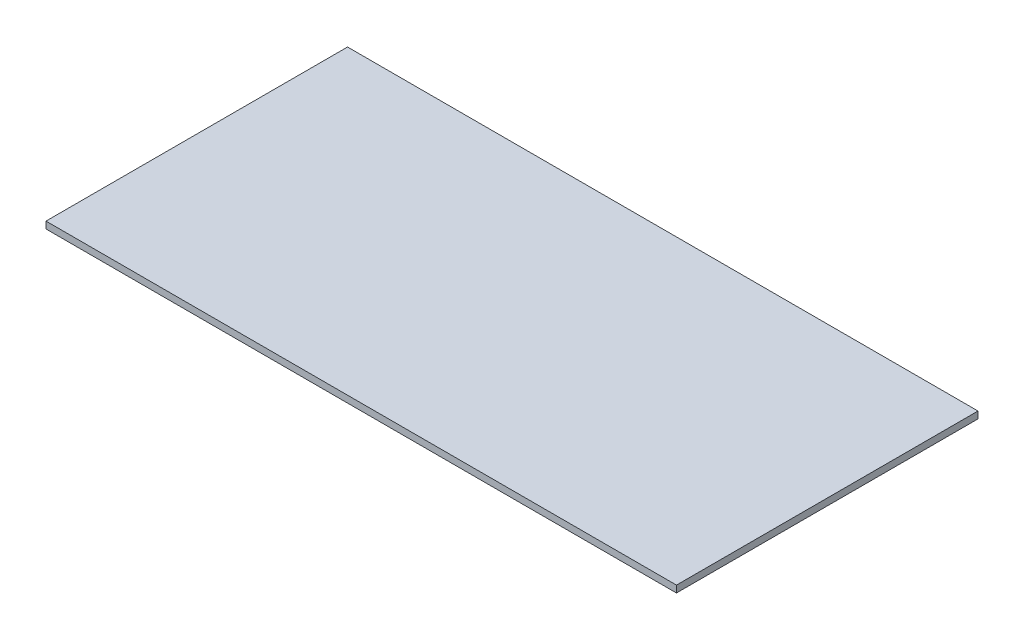
ISO-10303-21;
HEADER;
FILE_DESCRIPTION(('STEP AP214'),'2;1');
FILE_NAME('part.step','',(''),(''),'','','');
FILE_SCHEMA(('AUTOMOTIVE_DESIGN { 1 0 10303 214 1 1 1 1 }'));
ENDSEC;
DATA;
#1=APPLICATION_CONTEXT('core data for automotive mechanical design processes');
#2=APPLICATION_PROTOCOL_DEFINITION('international standard','automotive_design',2000,#1);
#3=PRODUCT_CONTEXT('',#1,'mechanical');
#4=PRODUCT('Part','Part','',(#3));
#5=PRODUCT_RELATED_PRODUCT_CATEGORY('part','',(#4));
#6=PRODUCT_DEFINITION_FORMATION('','',#4);
#7=PRODUCT_DEFINITION_CONTEXT('part definition',#1,'design');
#8=PRODUCT_DEFINITION('design','',#6,#7);
#9=PRODUCT_DEFINITION_SHAPE('','',#8);
#10=(LENGTH_UNIT() NAMED_UNIT(*) SI_UNIT(.MILLI.,.METRE.));
#11=(NAMED_UNIT(*) PLANE_ANGLE_UNIT() SI_UNIT($,.RADIAN.));
#12=(NAMED_UNIT(*) SI_UNIT($,.STERADIAN.) SOLID_ANGLE_UNIT());
#13=UNCERTAINTY_MEASURE_WITH_UNIT(LENGTH_MEASURE(1.E-05),#10,'distance_accuracy_value','');
#14=(GEOMETRIC_REPRESENTATION_CONTEXT(3) GLOBAL_UNCERTAINTY_ASSIGNED_CONTEXT((#13)) GLOBAL_UNIT_ASSIGNED_CONTEXT((#10,
#11,#12)) REPRESENTATION_CONTEXT('',''));
#15=CARTESIAN_POINT('',(0.,0.,0.));
#16=DIRECTION('',(0.,0.,1.));
#17=DIRECTION('',(1.,0.,0.));
#18=AXIS2_PLACEMENT_3D('',#15,#16,#17);
#19=CARTESIAN_POINT('',(-292.1,6.35,-139.7));
#20=DIRECTION('',(1.,0.,0.));
#21=DIRECTION('',(0.,0.,-1.));
#22=AXIS2_PLACEMENT_3D('',#19,#20,#21);
#23=PLANE('',#22);
#24=DIRECTION('',(0.,0.,1.));
#25=VECTOR('',#24,1.);
#26=CARTESIAN_POINT('',(-292.1,0.,-139.7));
#27=LINE('',#26,#25);
#28=CARTESIAN_POINT('',(-292.1,0.,-139.7));
#29=VERTEX_POINT('',#28);
#30=CARTESIAN_POINT('',(-292.1,0.,139.7));
#31=VERTEX_POINT('',#30);
#32=EDGE_CURVE('E101',#29,#31,#27,.T.);
#33=ORIENTED_EDGE('',*,*,#32,.T.);
#34=DIRECTION('',(0.,-1.,0.));
#35=VECTOR('',#34,1.);
#36=CARTESIAN_POINT('',(-292.1,6.35,139.7));
#37=LINE('',#36,#35);
#38=CARTESIAN_POINT('',(-292.1,6.35,139.7));
#39=VERTEX_POINT('',#38);
#40=EDGE_CURVE('E11',#39,#31,#37,.T.);
#41=ORIENTED_EDGE('',*,*,#40,.F.);
#42=DIRECTION('',(0.,0.,1.));
#43=VECTOR('',#42,1.);
#44=CARTESIAN_POINT('',(-292.1,6.35,-139.7));
#45=LINE('',#44,#43);
#46=CARTESIAN_POINT('',(-292.1,6.35,-139.7));
#47=VERTEX_POINT('',#46);
#48=EDGE_CURVE('E89',#47,#39,#45,.T.);
#49=ORIENTED_EDGE('',*,*,#48,.F.);
#50=DIRECTION('',(0.,-1.,0.));
#51=VECTOR('',#50,1.);
#52=CARTESIAN_POINT('',(-292.1,6.35,-139.7));
#53=LINE('',#52,#51);
#54=EDGE_CURVE('E97',#47,#29,#53,.T.);
#55=ORIENTED_EDGE('',*,*,#54,.T.);
#56=EDGE_LOOP('',(#33,#41,#49,#55));
#57=FACE_BOUND('',#56,.T.);
#58=ADVANCED_FACE('F38',(#57),#23,.F.);
#59=CARTESIAN_POINT('',(-292.1,6.35,139.7));
#60=DIRECTION('',(0.,0.,-1.));
#61=DIRECTION('',(-1.,0.,0.));
#62=AXIS2_PLACEMENT_3D('',#59,#60,#61);
#63=PLANE('',#62);
#64=DIRECTION('',(1.,0.,0.));
#65=VECTOR('',#64,1.);
#66=CARTESIAN_POINT('',(-292.1,0.,139.7));
#67=LINE('',#66,#65);
#68=CARTESIAN_POINT('',(292.1,0.,139.7));
#69=VERTEX_POINT('',#68);
#70=EDGE_CURVE('E93',#31,#69,#67,.T.);
#71=ORIENTED_EDGE('',*,*,#70,.T.);
#72=DIRECTION('',(0.,-1.,0.));
#73=VECTOR('',#72,1.);
#74=CARTESIAN_POINT('',(292.1,6.35,139.7));
#75=LINE('',#74,#73);
#76=CARTESIAN_POINT('',(292.1,6.35,139.7));
#77=VERTEX_POINT('',#76);
#78=EDGE_CURVE('E46',#77,#69,#75,.T.);
#79=ORIENTED_EDGE('',*,*,#78,.F.);
#80=DIRECTION('',(1.,0.,0.));
#81=VECTOR('',#80,1.);
#82=CARTESIAN_POINT('',(-292.1,6.35,139.7));
#83=LINE('',#82,#81);
#84=EDGE_CURVE('E84',#39,#77,#83,.T.);
#85=ORIENTED_EDGE('',*,*,#84,.F.);
#86=ORIENTED_EDGE('',*,*,#40,.T.);
#87=EDGE_LOOP('',(#71,#79,#85,#86));
#88=FACE_BOUND('',#87,.T.);
#89=ADVANCED_FACE('F92',(#88),#63,.F.);
#90=CARTESIAN_POINT('',(292.1,6.35,-139.7));
#91=DIRECTION('',(-1.,0.,0.));
#92=DIRECTION('',(0.,0.,1.));
#93=AXIS2_PLACEMENT_3D('',#90,#91,#92);
#94=PLANE('',#93);
#95=DIRECTION('',(0.,0.,-1.));
#96=VECTOR('',#95,1.);
#97=CARTESIAN_POINT('',(292.1,0.,-139.7));
#98=LINE('',#97,#96);
#99=CARTESIAN_POINT('',(292.1,0.,-139.7));
#100=VERTEX_POINT('',#99);
#101=EDGE_CURVE('E71',#69,#100,#98,.T.);
#102=ORIENTED_EDGE('',*,*,#101,.T.);
#103=DIRECTION('',(0.,-1.,0.));
#104=VECTOR('',#103,1.);
#105=CARTESIAN_POINT('',(292.1,6.35,-139.7));
#106=LINE('',#105,#104);
#107=CARTESIAN_POINT('',(292.1,6.35,-139.7));
#108=VERTEX_POINT('',#107);
#109=EDGE_CURVE('E94',#108,#100,#106,.T.);
#110=ORIENTED_EDGE('',*,*,#109,.F.);
#111=DIRECTION('',(0.,0.,-1.));
#112=VECTOR('',#111,1.);
#113=CARTESIAN_POINT('',(292.1,6.35,-139.7));
#114=LINE('',#113,#112);
#115=EDGE_CURVE('E87',#77,#108,#114,.T.);
#116=ORIENTED_EDGE('',*,*,#115,.F.);
#117=ORIENTED_EDGE('',*,*,#78,.T.);
#118=EDGE_LOOP('',(#102,#110,#116,#117));
#119=FACE_BOUND('',#118,.T.);
#120=ADVANCED_FACE('F95',(#119),#94,.F.);
#121=CARTESIAN_POINT('',(-292.1,6.35,-139.7));
#122=DIRECTION('',(0.,0.,1.));
#123=DIRECTION('',(1.,0.,0.));
#124=AXIS2_PLACEMENT_3D('',#121,#122,#123);
#125=PLANE('',#124);
#126=DIRECTION('',(-1.,0.,0.));
#127=VECTOR('',#126,1.);
#128=CARTESIAN_POINT('',(-292.1,0.,-139.7));
#129=LINE('',#128,#127);
#130=EDGE_CURVE('E77',#100,#29,#129,.T.);
#131=ORIENTED_EDGE('',*,*,#130,.T.);
#132=ORIENTED_EDGE('',*,*,#54,.F.);
#133=DIRECTION('',(-1.,0.,0.));
#134=VECTOR('',#133,1.);
#135=CARTESIAN_POINT('',(-292.1,6.35,-139.7));
#136=LINE('',#135,#134);
#137=EDGE_CURVE('E54',#108,#47,#136,.T.);
#138=ORIENTED_EDGE('',*,*,#137,.F.);
#139=ORIENTED_EDGE('',*,*,#109,.T.);
#140=EDGE_LOOP('',(#131,#132,#138,#139));
#141=FACE_BOUND('',#140,.T.);
#142=ADVANCED_FACE('F108',(#141),#125,.F.);
#143=CARTESIAN_POINT('',(0.,6.35,0.));
#144=DIRECTION('',(0.,1.,0.));
#145=DIRECTION('',(0.,0.,1.));
#146=AXIS2_PLACEMENT_3D('',#143,#144,#145);
#147=PLANE('',#146);
#148=ORIENTED_EDGE('',*,*,#48,.T.);
#149=ORIENTED_EDGE('',*,*,#84,.T.);
#150=ORIENTED_EDGE('',*,*,#115,.T.);
#151=ORIENTED_EDGE('',*,*,#137,.T.);
#152=EDGE_LOOP('',(#148,#149,#150,#151));
#153=FACE_BOUND('',#152,.T.);
#154=ADVANCED_FACE('F85',(#153),#147,.T.);
#155=CARTESIAN_POINT('',(0.,0.,0.));
#156=DIRECTION('',(0.,1.,0.));
#157=DIRECTION('',(0.,0.,1.));
#158=AXIS2_PLACEMENT_3D('',#155,#156,#157);
#159=PLANE('',#158);
#160=ORIENTED_EDGE('',*,*,#32,.F.);
#161=ORIENTED_EDGE('',*,*,#130,.F.);
#162=ORIENTED_EDGE('',*,*,#101,.F.);
#163=ORIENTED_EDGE('',*,*,#70,.F.);
#164=EDGE_LOOP('',(#160,#161,#162,#163));
#165=FACE_BOUND('',#164,.T.);
#166=ADVANCED_FACE('F111',(#165),#159,.F.);
#167=CLOSED_SHELL('',(#58,#89,#120,#142,#154,#166));
#168=MANIFOLD_SOLID_BREP('B2',#167);
#169=ADVANCED_BREP_SHAPE_REPRESENTATION('',(#18,#168),#14);
#170=SHAPE_DEFINITION_REPRESENTATION(#9,#169);
ENDSEC;
END-ISO-10303-21;
